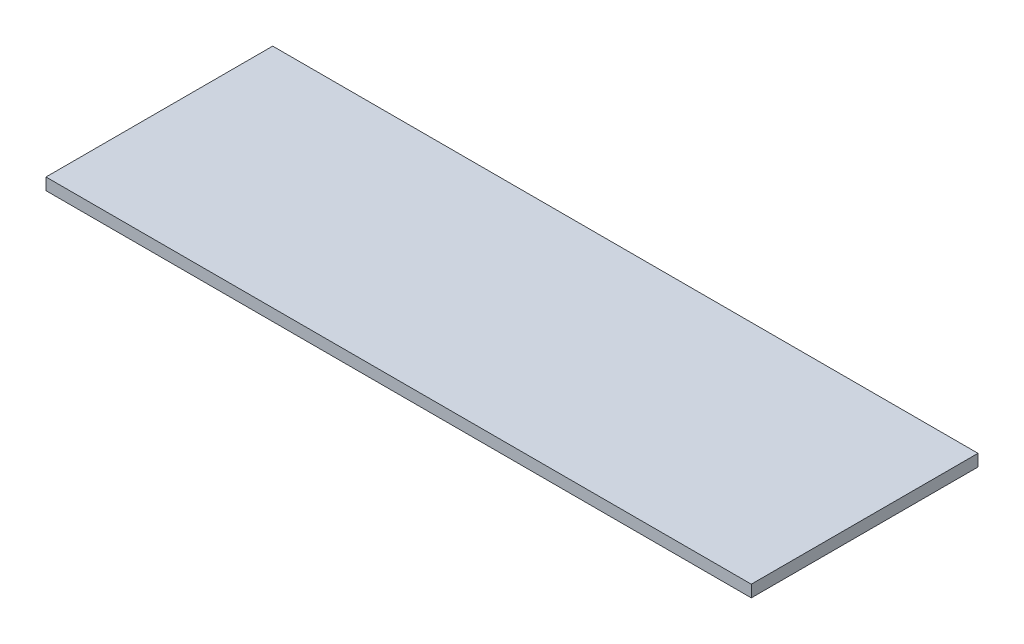
ISO-10303-21;
HEADER;
FILE_DESCRIPTION(('STEP AP214'),'2;1');
FILE_NAME('part.step','',(''),(''),'','','');
FILE_SCHEMA(('AUTOMOTIVE_DESIGN { 1 0 10303 214 1 1 1 1 }'));
ENDSEC;
DATA;
#1=APPLICATION_CONTEXT('core data for automotive mechanical design processes');
#2=APPLICATION_PROTOCOL_DEFINITION('international standard','automotive_design',2000,#1);
#3=PRODUCT_CONTEXT('',#1,'mechanical');
#4=PRODUCT('Part','Part','',(#3));
#5=PRODUCT_RELATED_PRODUCT_CATEGORY('part','',(#4));
#6=PRODUCT_DEFINITION_FORMATION('','',#4);
#7=PRODUCT_DEFINITION_CONTEXT('part definition',#1,'design');
#8=PRODUCT_DEFINITION('design','',#6,#7);
#9=PRODUCT_DEFINITION_SHAPE('','',#8);
#10=(LENGTH_UNIT() NAMED_UNIT(*) SI_UNIT(.MILLI.,.METRE.));
#11=(NAMED_UNIT(*) PLANE_ANGLE_UNIT() SI_UNIT($,.RADIAN.));
#12=(NAMED_UNIT(*) SI_UNIT($,.STERADIAN.) SOLID_ANGLE_UNIT());
#13=UNCERTAINTY_MEASURE_WITH_UNIT(LENGTH_MEASURE(1.E-05),#10,'distance_accuracy_value','');
#14=(GEOMETRIC_REPRESENTATION_CONTEXT(3) GLOBAL_UNCERTAINTY_ASSIGNED_CONTEXT((#13)) GLOBAL_UNIT_ASSIGNED_CONTEXT((#10,
#11,#12)) REPRESENTATION_CONTEXT('',''));
#15=CARTESIAN_POINT('',(0.,0.,0.));
#16=DIRECTION('',(0.,0.,1.));
#17=DIRECTION('',(1.,0.,0.));
#18=AXIS2_PLACEMENT_3D('',#15,#16,#17);
#19=CARTESIAN_POINT('',(0.,3.,0.));
#20=DIRECTION('',(1.,0.,0.));
#21=DIRECTION('',(0.,0.,-1.));
#22=AXIS2_PLACEMENT_3D('',#19,#20,#21);
#23=PLANE('',#22);
#24=DIRECTION('',(0.,0.,1.));
#25=VECTOR('',#24,1.);
#26=CARTESIAN_POINT('',(0.,0.,0.));
#27=LINE('',#26,#25);
#28=CARTESIAN_POINT('',(0.,0.,-57.15));
#29=VERTEX_POINT('',#28);
#30=CARTESIAN_POINT('',(0.,0.,0.));
#31=VERTEX_POINT('',#30);
#32=EDGE_CURVE('E96',#29,#31,#27,.T.);
#33=ORIENTED_EDGE('',*,*,#32,.T.);
#34=DIRECTION('',(0.,-1.,0.));
#35=VECTOR('',#34,1.);
#36=CARTESIAN_POINT('',(0.,3.,0.));
#37=LINE('',#36,#35);
#38=CARTESIAN_POINT('',(0.,3.,0.));
#39=VERTEX_POINT('',#38);
#40=EDGE_CURVE('E11',#39,#31,#37,.T.);
#41=ORIENTED_EDGE('',*,*,#40,.F.);
#42=DIRECTION('',(0.,0.,1.));
#43=VECTOR('',#42,1.);
#44=CARTESIAN_POINT('',(0.,3.,0.));
#45=LINE('',#44,#43);
#46=CARTESIAN_POINT('',(0.,3.,-57.15));
#47=VERTEX_POINT('',#46);
#48=EDGE_CURVE('E84',#47,#39,#45,.T.);
#49=ORIENTED_EDGE('',*,*,#48,.F.);
#50=DIRECTION('',(0.,-1.,0.));
#51=VECTOR('',#50,1.);
#52=CARTESIAN_POINT('',(0.,3.,-57.15));
#53=LINE('',#52,#51);
#54=EDGE_CURVE('E92',#47,#29,#53,.T.);
#55=ORIENTED_EDGE('',*,*,#54,.T.);
#56=EDGE_LOOP('',(#33,#41,#49,#55));
#57=FACE_BOUND('',#56,.T.);
#58=ADVANCED_FACE('F33',(#57),#23,.F.);
#59=CARTESIAN_POINT('',(0.,3.,0.));
#60=DIRECTION('',(0.,0.,-1.));
#61=DIRECTION('',(-1.,0.,0.));
#62=AXIS2_PLACEMENT_3D('',#59,#60,#61);
#63=PLANE('',#62);
#64=DIRECTION('',(1.,0.,0.));
#65=VECTOR('',#64,1.);
#66=CARTESIAN_POINT('',(0.,0.,0.));
#67=LINE('',#66,#65);
#68=CARTESIAN_POINT('',(177.8,0.,0.));
#69=VERTEX_POINT('',#68);
#70=EDGE_CURVE('E88',#31,#69,#67,.T.);
#71=ORIENTED_EDGE('',*,*,#70,.T.);
#72=DIRECTION('',(0.,-1.,0.));
#73=VECTOR('',#72,1.);
#74=CARTESIAN_POINT('',(177.8,3.,0.));
#75=LINE('',#74,#73);
#76=CARTESIAN_POINT('',(177.8,3.,0.));
#77=VERTEX_POINT('',#76);
#78=EDGE_CURVE('E41',#77,#69,#75,.T.);
#79=ORIENTED_EDGE('',*,*,#78,.F.);
#80=DIRECTION('',(1.,0.,0.));
#81=VECTOR('',#80,1.);
#82=CARTESIAN_POINT('',(0.,3.,0.));
#83=LINE('',#82,#81);
#84=EDGE_CURVE('E79',#39,#77,#83,.T.);
#85=ORIENTED_EDGE('',*,*,#84,.F.);
#86=ORIENTED_EDGE('',*,*,#40,.T.);
#87=EDGE_LOOP('',(#71,#79,#85,#86));
#88=FACE_BOUND('',#87,.T.);
#89=ADVANCED_FACE('F87',(#88),#63,.F.);
#90=CARTESIAN_POINT('',(177.8,3.,0.));
#91=DIRECTION('',(-1.,0.,0.));
#92=DIRECTION('',(0.,0.,1.));
#93=AXIS2_PLACEMENT_3D('',#90,#91,#92);
#94=PLANE('',#93);
#95=DIRECTION('',(0.,0.,-1.));
#96=VECTOR('',#95,1.);
#97=CARTESIAN_POINT('',(177.8,0.,0.));
#98=LINE('',#97,#96);
#99=CARTESIAN_POINT('',(177.8,0.,-57.15));
#100=VERTEX_POINT('',#99);
#101=EDGE_CURVE('E66',#69,#100,#98,.T.);
#102=ORIENTED_EDGE('',*,*,#101,.T.);
#103=DIRECTION('',(0.,-1.,0.));
#104=VECTOR('',#103,1.);
#105=CARTESIAN_POINT('',(177.8,3.,-57.15));
#106=LINE('',#105,#104);
#107=CARTESIAN_POINT('',(177.8,3.,-57.15));
#108=VERTEX_POINT('',#107);
#109=EDGE_CURVE('E89',#108,#100,#106,.T.);
#110=ORIENTED_EDGE('',*,*,#109,.F.);
#111=DIRECTION('',(0.,0.,-1.));
#112=VECTOR('',#111,1.);
#113=CARTESIAN_POINT('',(177.8,3.,0.));
#114=LINE('',#113,#112);
#115=EDGE_CURVE('E82',#77,#108,#114,.T.);
#116=ORIENTED_EDGE('',*,*,#115,.F.);
#117=ORIENTED_EDGE('',*,*,#78,.T.);
#118=EDGE_LOOP('',(#102,#110,#116,#117));
#119=FACE_BOUND('',#118,.T.);
#120=ADVANCED_FACE('F90',(#119),#94,.F.);
#121=CARTESIAN_POINT('',(0.,3.,-57.15));
#122=DIRECTION('',(0.,0.,1.));
#123=DIRECTION('',(1.,0.,0.));
#124=AXIS2_PLACEMENT_3D('',#121,#122,#123);
#125=PLANE('',#124);
#126=DIRECTION('',(-1.,0.,0.));
#127=VECTOR('',#126,1.);
#128=CARTESIAN_POINT('',(0.,0.,-57.15));
#129=LINE('',#128,#127);
#130=EDGE_CURVE('E72',#100,#29,#129,.T.);
#131=ORIENTED_EDGE('',*,*,#130,.T.);
#132=ORIENTED_EDGE('',*,*,#54,.F.);
#133=DIRECTION('',(-1.,0.,0.));
#134=VECTOR('',#133,1.);
#135=CARTESIAN_POINT('',(0.,3.,-57.15));
#136=LINE('',#135,#134);
#137=EDGE_CURVE('E49',#108,#47,#136,.T.);
#138=ORIENTED_EDGE('',*,*,#137,.F.);
#139=ORIENTED_EDGE('',*,*,#109,.T.);
#140=EDGE_LOOP('',(#131,#132,#138,#139));
#141=FACE_BOUND('',#140,.T.);
#142=ADVANCED_FACE('F103',(#141),#125,.F.);
#143=CARTESIAN_POINT('',(0.,3.,0.));
#144=DIRECTION('',(0.,-1.,0.));
#145=DIRECTION('',(0.,0.,-1.));
#146=AXIS2_PLACEMENT_3D('',#143,#144,#145);
#147=PLANE('',#146);
#148=ORIENTED_EDGE('',*,*,#48,.T.);
#149=ORIENTED_EDGE('',*,*,#84,.T.);
#150=ORIENTED_EDGE('',*,*,#115,.T.);
#151=ORIENTED_EDGE('',*,*,#137,.T.);
#152=EDGE_LOOP('',(#148,#149,#150,#151));
#153=FACE_BOUND('',#152,.T.);
#154=ADVANCED_FACE('F80',(#153),#147,.F.);
#155=CARTESIAN_POINT('',(0.,0.,0.));
#156=DIRECTION('',(0.,-1.,0.));
#157=DIRECTION('',(0.,0.,-1.));
#158=AXIS2_PLACEMENT_3D('',#155,#156,#157);
#159=PLANE('',#158);
#160=ORIENTED_EDGE('',*,*,#32,.F.);
#161=ORIENTED_EDGE('',*,*,#130,.F.);
#162=ORIENTED_EDGE('',*,*,#101,.F.);
#163=ORIENTED_EDGE('',*,*,#70,.F.);
#164=EDGE_LOOP('',(#160,#161,#162,#163));
#165=FACE_BOUND('',#164,.T.);
#166=ADVANCED_FACE('F106',(#165),#159,.T.);
#167=CLOSED_SHELL('',(#58,#89,#120,#142,#154,#166));
#168=MANIFOLD_SOLID_BREP('B2',#167);
#169=ADVANCED_BREP_SHAPE_REPRESENTATION('',(#18,#168),#14);
#170=SHAPE_DEFINITION_REPRESENTATION(#9,#169);
ENDSEC;
END-ISO-10303-21;
